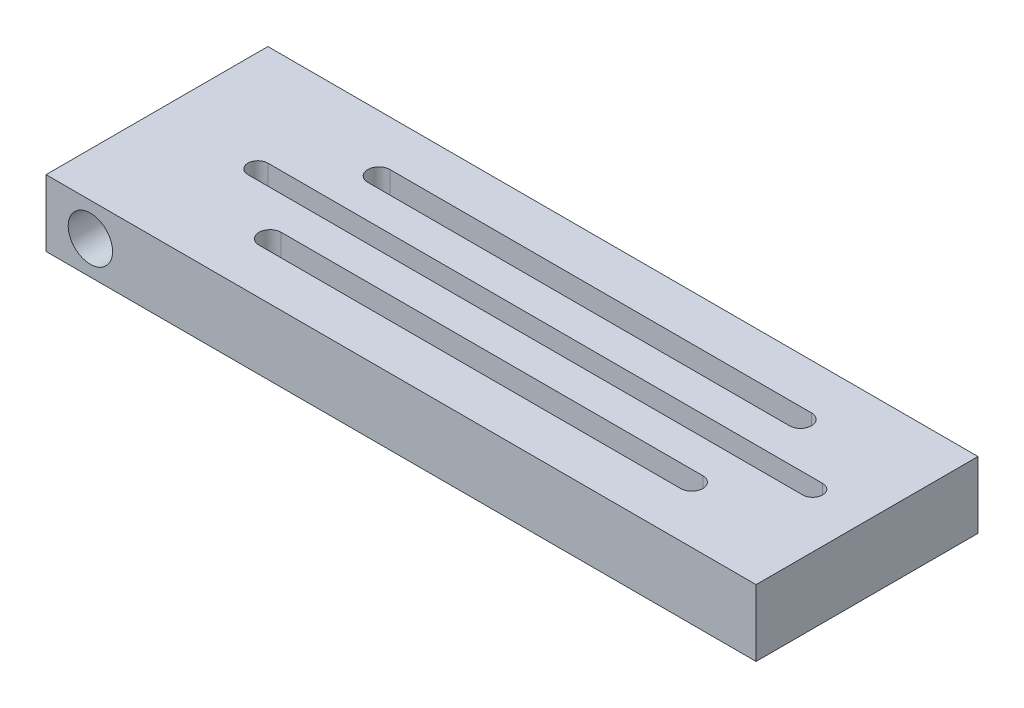
ISO-10303-21;
HEADER;
FILE_DESCRIPTION(('STEP AP214'),'2;1');
FILE_NAME('part.step','',(''),(''),'','','');
FILE_SCHEMA(('AUTOMOTIVE_DESIGN { 1 0 10303 214 1 1 1 1 }'));
ENDSEC;
DATA;
#1=APPLICATION_CONTEXT('core data for automotive mechanical design processes');
#2=APPLICATION_PROTOCOL_DEFINITION('international standard','automotive_design',2000,#1);
#3=PRODUCT_CONTEXT('',#1,'mechanical');
#4=PRODUCT('Part','Part','',(#3));
#5=PRODUCT_RELATED_PRODUCT_CATEGORY('part','',(#4));
#6=PRODUCT_DEFINITION_FORMATION('','',#4);
#7=PRODUCT_DEFINITION_CONTEXT('part definition',#1,'design');
#8=PRODUCT_DEFINITION('design','',#6,#7);
#9=PRODUCT_DEFINITION_SHAPE('','',#8);
#10=(LENGTH_UNIT() NAMED_UNIT(*) SI_UNIT(.MILLI.,.METRE.));
#11=(NAMED_UNIT(*) PLANE_ANGLE_UNIT() SI_UNIT($,.RADIAN.));
#12=(NAMED_UNIT(*) SI_UNIT($,.STERADIAN.) SOLID_ANGLE_UNIT());
#13=UNCERTAINTY_MEASURE_WITH_UNIT(LENGTH_MEASURE(1.E-05),#10,'distance_accuracy_value','');
#14=(GEOMETRIC_REPRESENTATION_CONTEXT(3) GLOBAL_UNCERTAINTY_ASSIGNED_CONTEXT((#13)) GLOBAL_UNIT_ASSIGNED_CONTEXT((#10,
#11,#12)) REPRESENTATION_CONTEXT('',''));
#15=CARTESIAN_POINT('',(0.,0.,0.));
#16=DIRECTION('',(0.,0.,1.));
#17=DIRECTION('',(1.,0.,0.));
#18=AXIS2_PLACEMENT_3D('',#15,#16,#17);
#19=CARTESIAN_POINT('',(-101.6,9.525,31.75));
#20=DIRECTION('',(-1.,0.,0.));
#21=DIRECTION('',(0.,0.,1.));
#22=AXIS2_PLACEMENT_3D('',#19,#20,#21);
#23=PLANE('',#22);
#24=DIRECTION('',(0.,0.,-1.));
#25=VECTOR('',#24,1.);
#26=CARTESIAN_POINT('',(-101.6,-9.525,31.75));
#27=LINE('',#26,#25);
#28=CARTESIAN_POINT('',(-101.6,-9.525,31.75));
#29=VERTEX_POINT('',#28);
#30=CARTESIAN_POINT('',(-101.6,-9.525,-31.75));
#31=VERTEX_POINT('',#30);
#32=EDGE_CURVE('E587',#29,#31,#27,.T.);
#33=ORIENTED_EDGE('',*,*,#32,.F.);
#34=DIRECTION('',(0.,-1.,0.));
#35=VECTOR('',#34,1.);
#36=CARTESIAN_POINT('',(-101.6,9.525,31.75));
#37=LINE('',#36,#35);
#38=CARTESIAN_POINT('',(-101.6,9.525,31.75));
#39=VERTEX_POINT('',#38);
#40=EDGE_CURVE('E12',#39,#29,#37,.T.);
#41=ORIENTED_EDGE('',*,*,#40,.F.);
#42=DIRECTION('',(0.,0.,-1.));
#43=VECTOR('',#42,1.);
#44=CARTESIAN_POINT('',(-101.6,9.525,31.75));
#45=LINE('',#44,#43);
#46=CARTESIAN_POINT('',(-101.6,9.525,-31.75));
#47=VERTEX_POINT('',#46);
#48=EDGE_CURVE('E344',#39,#47,#45,.T.);
#49=ORIENTED_EDGE('',*,*,#48,.T.);
#50=DIRECTION('',(0.,-1.,0.));
#51=VECTOR('',#50,1.);
#52=CARTESIAN_POINT('',(-101.6,9.525,-31.75));
#53=LINE('',#52,#51);
#54=EDGE_CURVE('E49',#47,#31,#53,.T.);
#55=ORIENTED_EDGE('',*,*,#54,.T.);
#56=EDGE_LOOP('',(#33,#41,#49,#55));
#57=FACE_BOUND('',#56,.T.);
#58=ADVANCED_FACE('F46',(#57),#23,.T.);
#59=CARTESIAN_POINT('',(-101.6,9.525,31.75));
#60=DIRECTION('',(0.,0.,-1.));
#61=DIRECTION('',(-1.,0.,0.));
#62=AXIS2_PLACEMENT_3D('',#59,#60,#61);
#63=PLANE('',#62);
#64=CARTESIAN_POINT('',(-88.9,0.,31.75));
#65=DIRECTION('',(0.,0.,-1.));
#66=DIRECTION('',(-1.,0.,0.));
#67=AXIS2_PLACEMENT_3D('',#64,#65,#66);
#68=CIRCLE('',#67,6.35);
#69=CARTESIAN_POINT('',(-95.25,0.,31.75));
#70=VERTEX_POINT('',#69);
#71=EDGE_CURVE('E197',#70,#70,#68,.F.);
#72=ORIENTED_EDGE('',*,*,#71,.F.);
#73=EDGE_LOOP('',(#72));
#74=FACE_BOUND('',#73,.T.);
#75=DIRECTION('',(1.,0.,0.));
#76=VECTOR('',#75,1.);
#77=CARTESIAN_POINT('',(-101.6,-9.525,31.75));
#78=LINE('',#77,#76);
#79=CARTESIAN_POINT('',(101.6,-9.525,31.75));
#80=VERTEX_POINT('',#79);
#81=EDGE_CURVE('E608',#29,#80,#78,.T.);
#82=ORIENTED_EDGE('',*,*,#81,.T.);
#83=DIRECTION('',(0.,-1.,0.));
#84=VECTOR('',#83,1.);
#85=CARTESIAN_POINT('',(101.6,9.525,31.75));
#86=LINE('',#85,#84);
#87=CARTESIAN_POINT('',(101.6,9.525,31.75));
#88=VERTEX_POINT('',#87);
#89=EDGE_CURVE('E56',#88,#80,#86,.T.);
#90=ORIENTED_EDGE('',*,*,#89,.F.);
#91=DIRECTION('',(1.,0.,0.));
#92=VECTOR('',#91,1.);
#93=CARTESIAN_POINT('',(-101.6,9.525,31.75));
#94=LINE('',#93,#92);
#95=EDGE_CURVE('E350',#39,#88,#94,.T.);
#96=ORIENTED_EDGE('',*,*,#95,.F.);
#97=ORIENTED_EDGE('',*,*,#40,.T.);
#98=EDGE_LOOP('',(#82,#90,#96,#97));
#99=FACE_BOUND('',#98,.T.);
#100=ADVANCED_FACE('F368',(#74,#99),#63,.F.);
#101=CARTESIAN_POINT('',(101.6,9.525,31.75));
#102=DIRECTION('',(-1.,0.,0.));
#103=DIRECTION('',(0.,0.,1.));
#104=AXIS2_PLACEMENT_3D('',#101,#102,#103);
#105=PLANE('',#104);
#106=DIRECTION('',(0.,0.,-1.));
#107=VECTOR('',#106,1.);
#108=CARTESIAN_POINT('',(101.6,-9.525,31.75));
#109=LINE('',#108,#107);
#110=CARTESIAN_POINT('',(101.6,-9.525,-31.75));
#111=VERTEX_POINT('',#110);
#112=EDGE_CURVE('E599',#80,#111,#109,.T.);
#113=ORIENTED_EDGE('',*,*,#112,.T.);
#114=DIRECTION('',(0.,-1.,0.));
#115=VECTOR('',#114,1.);
#116=CARTESIAN_POINT('',(101.6,9.525,-31.75));
#117=LINE('',#116,#115);
#118=CARTESIAN_POINT('',(101.6,9.525,-31.75));
#119=VERTEX_POINT('',#118);
#120=EDGE_CURVE('E349',#119,#111,#117,.T.);
#121=ORIENTED_EDGE('',*,*,#120,.F.);
#122=DIRECTION('',(0.,0.,-1.));
#123=VECTOR('',#122,1.);
#124=CARTESIAN_POINT('',(101.6,9.525,31.75));
#125=LINE('',#124,#123);
#126=EDGE_CURVE('E343',#88,#119,#125,.T.);
#127=ORIENTED_EDGE('',*,*,#126,.F.);
#128=ORIENTED_EDGE('',*,*,#89,.T.);
#129=EDGE_LOOP('',(#113,#121,#127,#128));
#130=FACE_BOUND('',#129,.T.);
#131=ADVANCED_FACE('F360',(#130),#105,.F.);
#132=CARTESIAN_POINT('',(-101.6,9.525,-31.75));
#133=DIRECTION('',(0.,0.,-1.));
#134=DIRECTION('',(-1.,0.,0.));
#135=AXIS2_PLACEMENT_3D('',#132,#133,#134);
#136=PLANE('',#135);
#137=CARTESIAN_POINT('',(-88.9,0.,-31.75));
#138=DIRECTION('',(0.,0.,-1.));
#139=DIRECTION('',(-1.,0.,0.));
#140=AXIS2_PLACEMENT_3D('',#137,#138,#139);
#141=CIRCLE('',#140,6.35);
#142=CARTESIAN_POINT('',(-95.25,0.,-31.75));
#143=VERTEX_POINT('',#142);
#144=EDGE_CURVE('E689',#143,#143,#141,.T.);
#145=ORIENTED_EDGE('',*,*,#144,.F.);
#146=EDGE_LOOP('',(#145));
#147=FACE_BOUND('',#146,.T.);
#148=DIRECTION('',(1.,0.,0.));
#149=VECTOR('',#148,1.);
#150=CARTESIAN_POINT('',(-101.6,-9.525,-31.75));
#151=LINE('',#150,#149);
#152=EDGE_CURVE('E595',#31,#111,#151,.T.);
#153=ORIENTED_EDGE('',*,*,#152,.F.);
#154=ORIENTED_EDGE('',*,*,#54,.F.);
#155=DIRECTION('',(1.,0.,0.));
#156=VECTOR('',#155,1.);
#157=CARTESIAN_POINT('',(-101.6,9.525,-31.75));
#158=LINE('',#157,#156);
#159=EDGE_CURVE('E339',#47,#119,#158,.T.);
#160=ORIENTED_EDGE('',*,*,#159,.T.);
#161=ORIENTED_EDGE('',*,*,#120,.T.);
#162=EDGE_LOOP('',(#153,#154,#160,#161));
#163=FACE_BOUND('',#162,.T.);
#164=ADVANCED_FACE('F353',(#147,#163),#136,.T.);
#165=CARTESIAN_POINT('',(0.,9.525,0.));
#166=DIRECTION('',(0.,-1.,0.));
#167=DIRECTION('',(0.,0.,-1.));
#168=AXIS2_PLACEMENT_3D('',#165,#166,#167);
#169=PLANE('',#168);
#170=DIRECTION('',(1.,0.,0.));
#171=VECTOR('',#170,1.);
#172=CARTESIAN_POINT('',(-53.6575,9.525,18.7325));
#173=LINE('',#172,#171);
#174=CARTESIAN_POINT('',(-53.6575,9.525,18.7325));
#175=VERTEX_POINT('',#174);
#176=CARTESIAN_POINT('',(66.9925,9.525,18.7325));
#177=VERTEX_POINT('',#176);
#178=EDGE_CURVE('E327',#175,#177,#173,.T.);
#179=ORIENTED_EDGE('',*,*,#178,.F.);
#180=CARTESIAN_POINT('',(-53.6575,9.525,15.5575));
#181=DIRECTION('',(0.,1.,0.));
#182=DIRECTION('',(0.,0.,1.));
#183=AXIS2_PLACEMENT_3D('',#180,#181,#182);
#184=CIRCLE('',#183,3.175);
#185=CARTESIAN_POINT('',(-53.6575,9.525,12.3825));
#186=VERTEX_POINT('',#185);
#187=EDGE_CURVE('E64',#186,#175,#184,.T.);
#188=ORIENTED_EDGE('',*,*,#187,.F.);
#189=DIRECTION('',(-1.,0.,0.));
#190=VECTOR('',#189,1.);
#191=CARTESIAN_POINT('',(-53.6575,9.525,12.3825));
#192=LINE('',#191,#190);
#193=CARTESIAN_POINT('',(66.9925,9.525,12.3825));
#194=VERTEX_POINT('',#193);
#195=EDGE_CURVE('E284',#194,#186,#192,.T.);
#196=ORIENTED_EDGE('',*,*,#195,.F.);
#197=CARTESIAN_POINT('',(66.9925,9.525,15.5575));
#198=DIRECTION('',(0.,1.,0.));
#199=DIRECTION('',(0.,0.,1.));
#200=AXIS2_PLACEMENT_3D('',#197,#198,#199);
#201=CIRCLE('',#200,3.175);
#202=EDGE_CURVE('E331',#177,#194,#201,.T.);
#203=ORIENTED_EDGE('',*,*,#202,.F.);
#204=EDGE_LOOP('',(#179,#188,#196,#203));
#205=FACE_BOUND('',#204,.T.);
#206=DIRECTION('',(1.,0.,0.));
#207=VECTOR('',#206,1.);
#208=CARTESIAN_POINT('',(-53.6575,9.525,-12.3825));
#209=LINE('',#208,#207);
#210=CARTESIAN_POINT('',(-53.6575,9.525,-12.3825));
#211=VERTEX_POINT('',#210);
#212=CARTESIAN_POINT('',(66.9925,9.525,-12.3825));
#213=VERTEX_POINT('',#212);
#214=EDGE_CURVE('E296',#211,#213,#209,.T.);
#215=ORIENTED_EDGE('',*,*,#214,.F.);
#216=CARTESIAN_POINT('',(-53.6575,9.525,-15.5575));
#217=DIRECTION('',(0.,1.,0.));
#218=DIRECTION('',(0.,0.,1.));
#219=AXIS2_PLACEMENT_3D('',#216,#217,#218);
#220=CIRCLE('',#219,3.175);
#221=CARTESIAN_POINT('',(-53.6575,9.525,-18.7325));
#222=VERTEX_POINT('',#221);
#223=EDGE_CURVE('E72',#222,#211,#220,.T.);
#224=ORIENTED_EDGE('',*,*,#223,.F.);
#225=DIRECTION('',(-1.,0.,0.));
#226=VECTOR('',#225,1.);
#227=CARTESIAN_POINT('',(-53.6575,9.525,-18.7325));
#228=LINE('',#227,#226);
#229=CARTESIAN_POINT('',(66.9925,9.525,-18.7325));
#230=VERTEX_POINT('',#229);
#231=EDGE_CURVE('E186',#230,#222,#228,.T.);
#232=ORIENTED_EDGE('',*,*,#231,.F.);
#233=CARTESIAN_POINT('',(66.9925,9.525,-15.5575));
#234=DIRECTION('',(0.,1.,0.));
#235=DIRECTION('',(0.,0.,1.));
#236=AXIS2_PLACEMENT_3D('',#233,#234,#235);
#237=CIRCLE('',#236,3.175);
#238=EDGE_CURVE('E193',#213,#230,#237,.T.);
#239=ORIENTED_EDGE('',*,*,#238,.F.);
#240=EDGE_LOOP('',(#215,#224,#232,#239));
#241=FACE_BOUND('',#240,.T.);
#242=DIRECTION('',(1.,0.,0.));
#243=VECTOR('',#242,1.);
#244=CARTESIAN_POINT('',(-72.7075,9.525,2.8575));
#245=LINE('',#244,#243);
#246=CARTESIAN_POINT('',(-72.7075,9.525,2.8575));
#247=VERTEX_POINT('',#246);
#248=CARTESIAN_POINT('',(86.0425,9.525,2.8575));
#249=VERTEX_POINT('',#248);
#250=EDGE_CURVE('E209',#247,#249,#245,.T.);
#251=ORIENTED_EDGE('',*,*,#250,.F.);
#252=CARTESIAN_POINT('',(-72.7075,9.525,0.));
#253=DIRECTION('',(0.,1.,0.));
#254=DIRECTION('',(0.,0.,1.));
#255=AXIS2_PLACEMENT_3D('',#252,#253,#254);
#256=CIRCLE('',#255,2.8575);
#257=CARTESIAN_POINT('',(-72.7075,9.525,-2.8575));
#258=VERTEX_POINT('',#257);
#259=EDGE_CURVE('E214',#258,#247,#256,.T.);
#260=ORIENTED_EDGE('',*,*,#259,.F.);
#261=DIRECTION('',(-1.,0.,0.));
#262=VECTOR('',#261,1.);
#263=CARTESIAN_POINT('',(-72.7075,9.525,-2.8575));
#264=LINE('',#263,#262);
#265=CARTESIAN_POINT('',(86.0425,9.525,-2.8575));
#266=VERTEX_POINT('',#265);
#267=EDGE_CURVE('E221',#266,#258,#264,.T.);
#268=ORIENTED_EDGE('',*,*,#267,.F.);
#269=CARTESIAN_POINT('',(86.0425,9.525,0.));
#270=DIRECTION('',(0.,1.,0.));
#271=DIRECTION('',(0.,0.,1.));
#272=AXIS2_PLACEMENT_3D('',#269,#270,#271);
#273=CIRCLE('',#272,2.8575);
#274=EDGE_CURVE('E213',#249,#266,#273,.T.);
#275=ORIENTED_EDGE('',*,*,#274,.F.);
#276=EDGE_LOOP('',(#251,#260,#268,#275));
#277=FACE_BOUND('',#276,.T.);
#278=ORIENTED_EDGE('',*,*,#48,.F.);
#279=ORIENTED_EDGE('',*,*,#95,.T.);
#280=ORIENTED_EDGE('',*,*,#126,.T.);
#281=ORIENTED_EDGE('',*,*,#159,.F.);
#282=EDGE_LOOP('',(#278,#279,#280,#281));
#283=FACE_BOUND('',#282,.T.);
#284=ADVANCED_FACE('F359',(#205,#241,#277,#283),#169,.F.);
#285=CARTESIAN_POINT('',(0.,-9.525,0.));
#286=DIRECTION('',(0.,-1.,0.));
#287=DIRECTION('',(0.,0.,-1.));
#288=AXIS2_PLACEMENT_3D('',#285,#286,#287);
#289=PLANE('',#288);
#290=CARTESIAN_POINT('',(-53.6575,-9.525,15.5575));
#291=DIRECTION('',(0.,1.,0.));
#292=DIRECTION('',(0.,0.,1.));
#293=AXIS2_PLACEMENT_3D('',#290,#291,#292);
#294=CIRCLE('',#293,3.175);
#295=CARTESIAN_POINT('',(-53.6575,-9.525,12.3825));
#296=VERTEX_POINT('',#295);
#297=CARTESIAN_POINT('',(-53.6575,-9.525,18.7325));
#298=VERTEX_POINT('',#297);
#299=EDGE_CURVE('E278',#296,#298,#294,.T.);
#300=ORIENTED_EDGE('',*,*,#299,.T.);
#301=DIRECTION('',(1.,0.,0.));
#302=VECTOR('',#301,1.);
#303=CARTESIAN_POINT('',(-53.6575,-9.525,18.7325));
#304=LINE('',#303,#302);
#305=CARTESIAN_POINT('',(66.9925,-9.525,18.7325));
#306=VERTEX_POINT('',#305);
#307=EDGE_CURVE('E283',#298,#306,#304,.T.);
#308=ORIENTED_EDGE('',*,*,#307,.T.);
#309=CARTESIAN_POINT('',(66.9925,-9.525,15.5575));
#310=DIRECTION('',(0.,1.,0.));
#311=DIRECTION('',(0.,0.,1.));
#312=AXIS2_PLACEMENT_3D('',#309,#310,#311);
#313=CIRCLE('',#312,3.175);
#314=CARTESIAN_POINT('',(66.9925,-9.525,12.3825));
#315=VERTEX_POINT('',#314);
#316=EDGE_CURVE('E321',#306,#315,#313,.T.);
#317=ORIENTED_EDGE('',*,*,#316,.T.);
#318=DIRECTION('',(-1.,0.,0.));
#319=VECTOR('',#318,1.);
#320=CARTESIAN_POINT('',(-53.6575,-9.525,12.3825));
#321=LINE('',#320,#319);
#322=EDGE_CURVE('E262',#315,#296,#321,.T.);
#323=ORIENTED_EDGE('',*,*,#322,.T.);
#324=EDGE_LOOP('',(#300,#308,#317,#323));
#325=FACE_BOUND('',#324,.T.);
#326=CARTESIAN_POINT('',(-53.6575,-9.525,-15.5575));
#327=DIRECTION('',(0.,1.,0.));
#328=DIRECTION('',(0.,0.,1.));
#329=AXIS2_PLACEMENT_3D('',#326,#327,#328);
#330=CIRCLE('',#329,3.175);
#331=CARTESIAN_POINT('',(-53.6575,-9.525,-18.7325));
#332=VERTEX_POINT('',#331);
#333=CARTESIAN_POINT('',(-53.6575,-9.525,-12.3825));
#334=VERTEX_POINT('',#333);
#335=EDGE_CURVE('E164',#332,#334,#330,.T.);
#336=ORIENTED_EDGE('',*,*,#335,.T.);
#337=DIRECTION('',(1.,0.,0.));
#338=VECTOR('',#337,1.);
#339=CARTESIAN_POINT('',(-53.6575,-9.525,-12.3825));
#340=LINE('',#339,#338);
#341=CARTESIAN_POINT('',(66.9925,-9.525,-12.3825));
#342=VERTEX_POINT('',#341);
#343=EDGE_CURVE('E175',#334,#342,#340,.T.);
#344=ORIENTED_EDGE('',*,*,#343,.T.);
#345=CARTESIAN_POINT('',(66.9925,-9.525,-15.5575));
#346=DIRECTION('',(0.,1.,0.));
#347=DIRECTION('',(0.,0.,1.));
#348=AXIS2_PLACEMENT_3D('',#345,#346,#347);
#349=CIRCLE('',#348,3.175);
#350=CARTESIAN_POINT('',(66.9925,-9.525,-18.7325));
#351=VERTEX_POINT('',#350);
#352=EDGE_CURVE('E180',#342,#351,#349,.T.);
#353=ORIENTED_EDGE('',*,*,#352,.T.);
#354=DIRECTION('',(-1.,0.,0.));
#355=VECTOR('',#354,1.);
#356=CARTESIAN_POINT('',(-53.6575,-9.525,-18.7325));
#357=LINE('',#356,#355);
#358=EDGE_CURVE('E171',#351,#332,#357,.T.);
#359=ORIENTED_EDGE('',*,*,#358,.T.);
#360=EDGE_LOOP('',(#336,#344,#353,#359));
#361=FACE_BOUND('',#360,.T.);
#362=CARTESIAN_POINT('',(-72.7075,-9.525,0.));
#363=DIRECTION('',(0.,1.,0.));
#364=DIRECTION('',(0.,0.,1.));
#365=AXIS2_PLACEMENT_3D('',#362,#363,#364);
#366=CIRCLE('',#365,2.8575);
#367=CARTESIAN_POINT('',(-72.7075,-9.525,-2.8575));
#368=VERTEX_POINT('',#367);
#369=CARTESIAN_POINT('',(-72.7075,-9.525,2.8575));
#370=VERTEX_POINT('',#369);
#371=EDGE_CURVE('E226',#368,#370,#366,.T.);
#372=ORIENTED_EDGE('',*,*,#371,.T.);
#373=DIRECTION('',(1.,0.,0.));
#374=VECTOR('',#373,1.);
#375=CARTESIAN_POINT('',(-72.7075,-9.525,2.8575));
#376=LINE('',#375,#374);
#377=CARTESIAN_POINT('',(86.0425,-9.525,2.8575));
#378=VERTEX_POINT('',#377);
#379=EDGE_CURVE('E236',#370,#378,#376,.T.);
#380=ORIENTED_EDGE('',*,*,#379,.T.);
#381=CARTESIAN_POINT('',(86.0425,-9.525,0.));
#382=DIRECTION('',(0.,1.,0.));
#383=DIRECTION('',(0.,0.,1.));
#384=AXIS2_PLACEMENT_3D('',#381,#382,#383);
#385=CIRCLE('',#384,2.8575);
#386=CARTESIAN_POINT('',(86.0425,-9.525,-2.8575));
#387=VERTEX_POINT('',#386);
#388=EDGE_CURVE('E241',#378,#387,#385,.T.);
#389=ORIENTED_EDGE('',*,*,#388,.T.);
#390=DIRECTION('',(-1.,0.,0.));
#391=VECTOR('',#390,1.);
#392=CARTESIAN_POINT('',(-72.7075,-9.525,-2.8575));
#393=LINE('',#392,#391);
#394=EDGE_CURVE('E247',#387,#368,#393,.T.);
#395=ORIENTED_EDGE('',*,*,#394,.T.);
#396=EDGE_LOOP('',(#372,#380,#389,#395));
#397=FACE_BOUND('',#396,.T.);
#398=ORIENTED_EDGE('',*,*,#32,.T.);
#399=ORIENTED_EDGE('',*,*,#152,.T.);
#400=ORIENTED_EDGE('',*,*,#112,.F.);
#401=ORIENTED_EDGE('',*,*,#81,.F.);
#402=EDGE_LOOP('',(#398,#399,#400,#401));
#403=FACE_BOUND('',#402,.T.);
#404=ADVANCED_FACE('F182',(#325,#361,#397,#403),#289,.T.);
#405=CARTESIAN_POINT('',(-72.7075,-9.525,0.));
#406=DIRECTION('',(0.,1.,0.));
#407=DIRECTION('',(0.,0.,1.));
#408=AXIS2_PLACEMENT_3D('',#405,#406,#407);
#409=CYLINDRICAL_SURFACE('',#408,2.8575);
#410=ORIENTED_EDGE('',*,*,#259,.T.);
#411=DIRECTION('',(0.,1.,0.));
#412=VECTOR('',#411,1.);
#413=CARTESIAN_POINT('',(-72.7075,-9.525,2.8575));
#414=LINE('',#413,#412);
#415=EDGE_CURVE('E251',#370,#247,#414,.T.);
#416=ORIENTED_EDGE('',*,*,#415,.F.);
#417=ORIENTED_EDGE('',*,*,#371,.F.);
#418=DIRECTION('',(0.,1.,0.));
#419=VECTOR('',#418,1.);
#420=CARTESIAN_POINT('',(-72.7075,-9.525,-2.8575));
#421=LINE('',#420,#419);
#422=EDGE_CURVE('E227',#368,#258,#421,.T.);
#423=ORIENTED_EDGE('',*,*,#422,.T.);
#424=EDGE_LOOP('',(#410,#416,#417,#423));
#425=FACE_BOUND('',#424,.T.);
#426=ADVANCED_FACE('F479',(#425),#409,.F.);
#427=CARTESIAN_POINT('',(-72.7075,-9.525,-2.8575));
#428=DIRECTION('',(0.,0.,-1.));
#429=DIRECTION('',(-1.,0.,0.));
#430=AXIS2_PLACEMENT_3D('',#427,#428,#429);
#431=PLANE('',#430);
#432=ORIENTED_EDGE('',*,*,#267,.T.);
#433=ORIENTED_EDGE('',*,*,#422,.F.);
#434=ORIENTED_EDGE('',*,*,#394,.F.);
#435=DIRECTION('',(0.,1.,0.));
#436=VECTOR('',#435,1.);
#437=CARTESIAN_POINT('',(86.0425,-9.525,-2.8575));
#438=LINE('',#437,#436);
#439=EDGE_CURVE('E601',#387,#266,#438,.T.);
#440=ORIENTED_EDGE('',*,*,#439,.T.);
#441=EDGE_LOOP('',(#432,#433,#434,#440));
#442=FACE_BOUND('',#441,.T.);
#443=ADVANCED_FACE('F470',(#442),#431,.F.);
#444=CARTESIAN_POINT('',(86.0425,-9.525,0.));
#445=DIRECTION('',(0.,1.,0.));
#446=DIRECTION('',(0.,0.,1.));
#447=AXIS2_PLACEMENT_3D('',#444,#445,#446);
#448=CYLINDRICAL_SURFACE('',#447,2.8575);
#449=ORIENTED_EDGE('',*,*,#274,.T.);
#450=ORIENTED_EDGE('',*,*,#439,.F.);
#451=ORIENTED_EDGE('',*,*,#388,.F.);
#452=DIRECTION('',(0.,1.,0.));
#453=VECTOR('',#452,1.);
#454=CARTESIAN_POINT('',(86.0425,-9.525,2.8575));
#455=LINE('',#454,#453);
#456=EDGE_CURVE('E664',#378,#249,#455,.T.);
#457=ORIENTED_EDGE('',*,*,#456,.T.);
#458=EDGE_LOOP('',(#449,#450,#451,#457));
#459=FACE_BOUND('',#458,.T.);
#460=ADVANCED_FACE('F460',(#459),#448,.F.);
#461=CARTESIAN_POINT('',(-72.7075,-9.525,2.8575));
#462=DIRECTION('',(0.,0.,1.));
#463=DIRECTION('',(1.,0.,0.));
#464=AXIS2_PLACEMENT_3D('',#461,#462,#463);
#465=PLANE('',#464);
#466=ORIENTED_EDGE('',*,*,#250,.T.);
#467=ORIENTED_EDGE('',*,*,#456,.F.);
#468=ORIENTED_EDGE('',*,*,#379,.F.);
#469=ORIENTED_EDGE('',*,*,#415,.T.);
#470=EDGE_LOOP('',(#466,#467,#468,#469));
#471=FACE_BOUND('',#470,.T.);
#472=ADVANCED_FACE('F452',(#471),#465,.F.);
#473=CARTESIAN_POINT('',(-53.6575,-9.525,-15.5575));
#474=DIRECTION('',(0.,1.,0.));
#475=DIRECTION('',(0.,0.,1.));
#476=AXIS2_PLACEMENT_3D('',#473,#474,#475);
#477=CYLINDRICAL_SURFACE('',#476,3.175);
#478=ORIENTED_EDGE('',*,*,#223,.T.);
#479=DIRECTION('',(0.,1.,0.));
#480=VECTOR('',#479,1.);
#481=CARTESIAN_POINT('',(-53.6575,-9.525,-12.3825));
#482=LINE('',#481,#480);
#483=EDGE_CURVE('E160',#334,#211,#482,.T.);
#484=ORIENTED_EDGE('',*,*,#483,.F.);
#485=ORIENTED_EDGE('',*,*,#335,.F.);
#486=DIRECTION('',(0.,1.,0.));
#487=VECTOR('',#486,1.);
#488=CARTESIAN_POINT('',(-53.6575,-9.525,-18.7325));
#489=LINE('',#488,#487);
#490=EDGE_CURVE('E305',#332,#222,#489,.T.);
#491=ORIENTED_EDGE('',*,*,#490,.T.);
#492=EDGE_LOOP('',(#478,#484,#485,#491));
#493=FACE_BOUND('',#492,.T.);
#494=ADVANCED_FACE('F162',(#493),#477,.F.);
#495=CARTESIAN_POINT('',(-53.6575,-9.525,-18.7325));
#496=DIRECTION('',(0.,0.,-1.));
#497=DIRECTION('',(-1.,0.,0.));
#498=AXIS2_PLACEMENT_3D('',#495,#496,#497);
#499=PLANE('',#498);
#500=ORIENTED_EDGE('',*,*,#231,.T.);
#501=ORIENTED_EDGE('',*,*,#490,.F.);
#502=ORIENTED_EDGE('',*,*,#358,.F.);
#503=DIRECTION('',(0.,1.,0.));
#504=VECTOR('',#503,1.);
#505=CARTESIAN_POINT('',(66.9925,-9.525,-18.7325));
#506=LINE('',#505,#504);
#507=EDGE_CURVE('E677',#351,#230,#506,.T.);
#508=ORIENTED_EDGE('',*,*,#507,.T.);
#509=EDGE_LOOP('',(#500,#501,#502,#508));
#510=FACE_BOUND('',#509,.T.);
#511=ADVANCED_FACE('F435',(#510),#499,.F.);
#512=CARTESIAN_POINT('',(66.9925,-9.525,-15.5575));
#513=DIRECTION('',(0.,1.,0.));
#514=DIRECTION('',(0.,0.,1.));
#515=AXIS2_PLACEMENT_3D('',#512,#513,#514);
#516=CYLINDRICAL_SURFACE('',#515,3.175);
#517=ORIENTED_EDGE('',*,*,#238,.T.);
#518=ORIENTED_EDGE('',*,*,#507,.F.);
#519=ORIENTED_EDGE('',*,*,#352,.F.);
#520=DIRECTION('',(0.,1.,0.));
#521=VECTOR('',#520,1.);
#522=CARTESIAN_POINT('',(66.9925,-9.525,-12.3825));
#523=LINE('',#522,#521);
#524=EDGE_CURVE('E170',#342,#213,#523,.T.);
#525=ORIENTED_EDGE('',*,*,#524,.T.);
#526=EDGE_LOOP('',(#517,#518,#519,#525));
#527=FACE_BOUND('',#526,.T.);
#528=ADVANCED_FACE('F426',(#527),#516,.F.);
#529=CARTESIAN_POINT('',(-53.6575,-9.525,-12.3825));
#530=DIRECTION('',(0.,0.,1.));
#531=DIRECTION('',(1.,0.,0.));
#532=AXIS2_PLACEMENT_3D('',#529,#530,#531);
#533=PLANE('',#532);
#534=ORIENTED_EDGE('',*,*,#214,.T.);
#535=ORIENTED_EDGE('',*,*,#524,.F.);
#536=ORIENTED_EDGE('',*,*,#343,.F.);
#537=ORIENTED_EDGE('',*,*,#483,.T.);
#538=EDGE_LOOP('',(#534,#535,#536,#537));
#539=FACE_BOUND('',#538,.T.);
#540=ADVANCED_FACE('F176',(#539),#533,.F.);
#541=CARTESIAN_POINT('',(-53.6575,-9.525,15.5575));
#542=DIRECTION('',(0.,1.,0.));
#543=DIRECTION('',(0.,0.,1.));
#544=AXIS2_PLACEMENT_3D('',#541,#542,#543);
#545=CYLINDRICAL_SURFACE('',#544,3.175);
#546=ORIENTED_EDGE('',*,*,#187,.T.);
#547=DIRECTION('',(0.,1.,0.));
#548=VECTOR('',#547,1.);
#549=CARTESIAN_POINT('',(-53.6575,-9.525,18.7325));
#550=LINE('',#549,#548);
#551=EDGE_CURVE('E257',#298,#175,#550,.T.);
#552=ORIENTED_EDGE('',*,*,#551,.F.);
#553=ORIENTED_EDGE('',*,*,#299,.F.);
#554=DIRECTION('',(0.,1.,0.));
#555=VECTOR('',#554,1.);
#556=CARTESIAN_POINT('',(-53.6575,-9.525,12.3825));
#557=LINE('',#556,#555);
#558=EDGE_CURVE('E313',#296,#186,#557,.T.);
#559=ORIENTED_EDGE('',*,*,#558,.T.);
#560=EDGE_LOOP('',(#546,#552,#553,#559));
#561=FACE_BOUND('',#560,.T.);
#562=ADVANCED_FACE('F410',(#561),#545,.F.);
#563=CARTESIAN_POINT('',(-53.6575,-9.525,12.3825));
#564=DIRECTION('',(0.,0.,-1.));
#565=DIRECTION('',(-1.,0.,0.));
#566=AXIS2_PLACEMENT_3D('',#563,#564,#565);
#567=PLANE('',#566);
#568=ORIENTED_EDGE('',*,*,#195,.T.);
#569=ORIENTED_EDGE('',*,*,#558,.F.);
#570=ORIENTED_EDGE('',*,*,#322,.F.);
#571=DIRECTION('',(0.,1.,0.));
#572=VECTOR('',#571,1.);
#573=CARTESIAN_POINT('',(66.9925,-9.525,12.3825));
#574=LINE('',#573,#572);
#575=EDGE_CURVE('E266',#315,#194,#574,.T.);
#576=ORIENTED_EDGE('',*,*,#575,.T.);
#577=EDGE_LOOP('',(#568,#569,#570,#576));
#578=FACE_BOUND('',#577,.T.);
#579=ADVANCED_FACE('F401',(#578),#567,.F.);
#580=CARTESIAN_POINT('',(66.9925,-9.525,15.5575));
#581=DIRECTION('',(0.,1.,0.));
#582=DIRECTION('',(0.,0.,1.));
#583=AXIS2_PLACEMENT_3D('',#580,#581,#582);
#584=CYLINDRICAL_SURFACE('',#583,3.175);
#585=ORIENTED_EDGE('',*,*,#202,.T.);
#586=ORIENTED_EDGE('',*,*,#575,.F.);
#587=ORIENTED_EDGE('',*,*,#316,.F.);
#588=DIRECTION('',(0.,1.,0.));
#589=VECTOR('',#588,1.);
#590=CARTESIAN_POINT('',(66.9925,-9.525,18.7325));
#591=LINE('',#590,#589);
#592=EDGE_CURVE('E261',#306,#177,#591,.T.);
#593=ORIENTED_EDGE('',*,*,#592,.T.);
#594=EDGE_LOOP('',(#585,#586,#587,#593));
#595=FACE_BOUND('',#594,.T.);
#596=ADVANCED_FACE('F392',(#595),#584,.F.);
#597=CARTESIAN_POINT('',(-53.6575,-9.525,18.7325));
#598=DIRECTION('',(0.,0.,1.));
#599=DIRECTION('',(1.,0.,0.));
#600=AXIS2_PLACEMENT_3D('',#597,#598,#599);
#601=PLANE('',#600);
#602=ORIENTED_EDGE('',*,*,#178,.T.);
#603=ORIENTED_EDGE('',*,*,#592,.F.);
#604=ORIENTED_EDGE('',*,*,#307,.F.);
#605=ORIENTED_EDGE('',*,*,#551,.T.);
#606=EDGE_LOOP('',(#602,#603,#604,#605));
#607=FACE_BOUND('',#606,.T.);
#608=ADVANCED_FACE('F382',(#607),#601,.F.);
#609=CARTESIAN_POINT('',(-88.9,0.,31.751));
#610=DIRECTION('',(0.,0.,-1.));
#611=DIRECTION('',(-1.,0.,0.));
#612=AXIS2_PLACEMENT_3D('',#609,#610,#611);
#613=CYLINDRICAL_SURFACE('',#612,6.35);
#614=ORIENTED_EDGE('',*,*,#144,.T.);
#615=EDGE_LOOP('',(#614));
#616=FACE_BOUND('',#615,.T.);
#617=ORIENTED_EDGE('',*,*,#71,.T.);
#618=EDGE_LOOP('',(#617));
#619=FACE_BOUND('',#618,.T.);
#620=ADVANCED_FACE('F378',(#616,#619),#613,.F.);
#621=CLOSED_SHELL('',(#58,#100,#131,#164,#284,#404,#426,#443,#460,#472,#494,#511,#528,#540,#562,
#579,#596,#608,#620));
#622=MANIFOLD_SOLID_BREP('B2',#621);
#623=ADVANCED_BREP_SHAPE_REPRESENTATION('',(#18,#622),#14);
#624=SHAPE_DEFINITION_REPRESENTATION(#9,#623);
ENDSEC;
END-ISO-10303-21;
